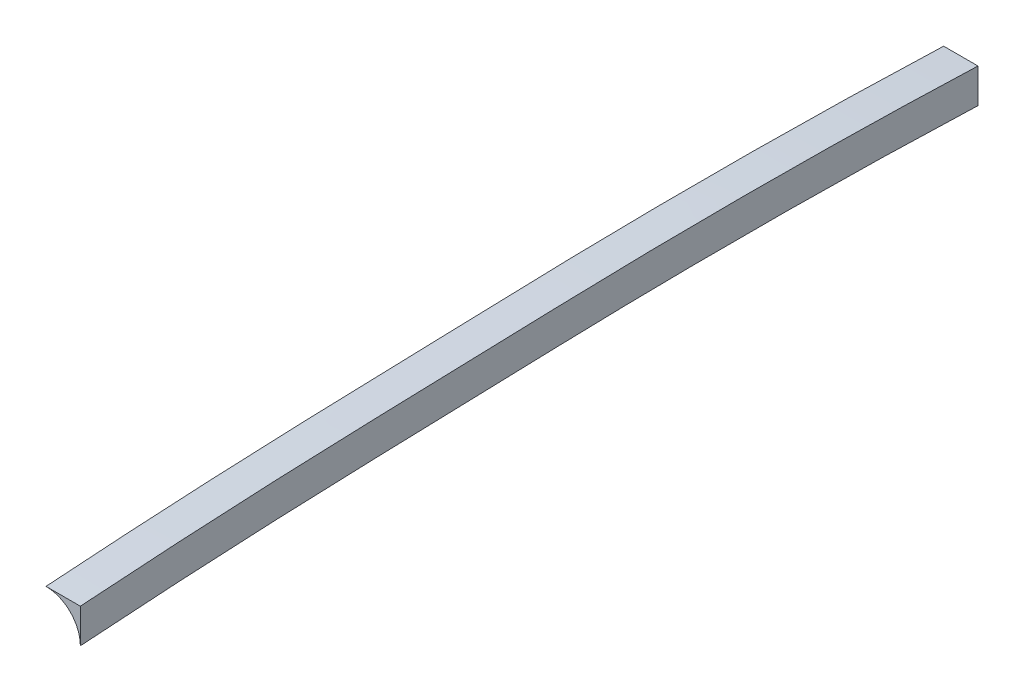
ISO-10303-21;
HEADER;
FILE_DESCRIPTION(('STEP AP214'),'2;1');
FILE_NAME('part.step','',(''),(''),'','','');
FILE_SCHEMA(('AUTOMOTIVE_DESIGN { 1 0 10303 214 1 1 1 1 }'));
ENDSEC;
DATA;
#1=APPLICATION_CONTEXT('core data for automotive mechanical design processes');
#2=APPLICATION_PROTOCOL_DEFINITION('international standard','automotive_design',2000,#1);
#3=PRODUCT_CONTEXT('',#1,'mechanical');
#4=PRODUCT('Part','Part','',(#3));
#5=PRODUCT_RELATED_PRODUCT_CATEGORY('part','',(#4));
#6=PRODUCT_DEFINITION_FORMATION('','',#4);
#7=PRODUCT_DEFINITION_CONTEXT('part definition',#1,'design');
#8=PRODUCT_DEFINITION('design','',#6,#7);
#9=PRODUCT_DEFINITION_SHAPE('','',#8);
#10=(LENGTH_UNIT() NAMED_UNIT(*) SI_UNIT(.MILLI.,.METRE.));
#11=(NAMED_UNIT(*) PLANE_ANGLE_UNIT() SI_UNIT($,.RADIAN.));
#12=(NAMED_UNIT(*) SI_UNIT($,.STERADIAN.) SOLID_ANGLE_UNIT());
#13=UNCERTAINTY_MEASURE_WITH_UNIT(LENGTH_MEASURE(1.E-05),#10,'distance_accuracy_value','');
#14=(GEOMETRIC_REPRESENTATION_CONTEXT(3) GLOBAL_UNCERTAINTY_ASSIGNED_CONTEXT((#13)) GLOBAL_UNIT_ASSIGNED_CONTEXT((#10,
#11,#12)) REPRESENTATION_CONTEXT('',''));
#15=CARTESIAN_POINT('',(0.,0.,0.));
#16=DIRECTION('',(0.,0.,1.));
#17=DIRECTION('',(1.,0.,0.));
#18=AXIS2_PLACEMENT_3D('',#15,#16,#17);
#19=CARTESIAN_POINT('',(-545.921789204398,117.985789350296,0.));
#20=DIRECTION('',(0.,0.,1.));
#21=DIRECTION('',(1.,0.,0.));
#22=AXIS2_PLACEMENT_3D('',#19,#20,#21);
#23=PLANE('',#22);
#24=DIRECTION('',(0.,-1.,0.));
#25=VECTOR('',#24,1.);
#26=CARTESIAN_POINT('',(-469.721789204398,194.185789350296,0.));
#27=LINE('',#26,#25);
#28=CARTESIAN_POINT('',(-469.721789204398,194.185789350296,0.));
#29=VERTEX_POINT('',#28);
#30=CARTESIAN_POINT('',(-469.721789204398,117.985789350296,0.));
#31=VERTEX_POINT('',#30);
#32=EDGE_CURVE('E294',#29,#31,#27,.T.);
#33=ORIENTED_EDGE('',*,*,#32,.F.);
#34=DIRECTION('',(1.,0.,0.));
#35=VECTOR('',#34,1.);
#36=CARTESIAN_POINT('',(-545.921789204398,194.185789350296,0.));
#37=LINE('',#36,#35);
#38=CARTESIAN_POINT('',(-545.921789204398,194.185789350296,0.));
#39=VERTEX_POINT('',#38);
#40=EDGE_CURVE('E13',#39,#29,#37,.T.);
#41=ORIENTED_EDGE('',*,*,#40,.F.);
#42=CARTESIAN_POINT('',(-545.921789204398,117.985789350296,0.));
#43=DIRECTION('',(0.,0.,1.));
#44=DIRECTION('',(1.,0.,0.));
#45=AXIS2_PLACEMENT_3D('',#42,#43,#44);
#46=CIRCLE('',#45,76.2);
#47=EDGE_CURVE('E71',#31,#39,#46,.T.);
#48=ORIENTED_EDGE('',*,*,#47,.F.);
#49=EDGE_LOOP('',(#33,#41,#48));
#50=FACE_BOUND('',#49,.T.);
#51=ADVANCED_FACE('F61',(#50),#23,.T.);
#52=CARTESIAN_POINT('',(-606.847797557808,99.1964787102209,-2052.91158045471));
#53=DIRECTION('',(0.,0.,-1.));
#54=DIRECTION('',(-1.,0.,0.));
#55=AXIS2_PLACEMENT_3D('',#52,#53,#54);
#56=PLANE('',#55);
#57=DIRECTION('',(1.,0.,0.));
#58=VECTOR('',#57,1.);
#59=CARTESIAN_POINT('',(-606.847797557808,175.396478710221,-2052.91158045471));
#60=LINE('',#59,#58);
#61=CARTESIAN_POINT('',(-606.847797557808,175.396478710221,-2052.91158045471));
#62=VERTEX_POINT('',#61);
#63=CARTESIAN_POINT('',(-530.647797557808,175.396478710221,-2052.91158045471));
#64=VERTEX_POINT('',#63);
#65=EDGE_CURVE('E117',#62,#64,#60,.T.);
#66=ORIENTED_EDGE('',*,*,#65,.T.);
#67=DIRECTION('',(0.,-1.,0.));
#68=VECTOR('',#67,1.);
#69=CARTESIAN_POINT('',(-530.647797557808,175.396478710221,-2052.91158045471));
#70=LINE('',#69,#68);
#71=CARTESIAN_POINT('',(-530.647797557808,99.1964787102209,-2052.91158045471));
#72=VERTEX_POINT('',#71);
#73=EDGE_CURVE('E119',#64,#72,#70,.T.);
#74=ORIENTED_EDGE('',*,*,#73,.T.);
#75=CARTESIAN_POINT('',(-606.847797557808,99.1964787102209,-2052.91158045471));
#76=DIRECTION('',(0.,0.,-1.));
#77=DIRECTION('',(-1.,0.,0.));
#78=AXIS2_PLACEMENT_3D('',#75,#76,#77);
#79=CIRCLE('',#78,76.2);
#80=EDGE_CURVE('E113',#62,#72,#79,.T.);
#81=ORIENTED_EDGE('',*,*,#80,.F.);
#82=EDGE_LOOP('',(#66,#74,#81));
#83=FACE_BOUND('',#82,.T.);
#84=ADVANCED_FACE('F116',(#83),#56,.T.);
#85=CARTESIAN_POINT('',(-606.847797557808,175.396478710221,-2052.91158045471));
#86=CARTESIAN_POINT('',(-597.376372189328,196.648578021864,-1733.77039021659));
#87=CARTESIAN_POINT('',(-587.881578666639,207.342137707288,-1413.84180629096));
#88=CARTESIAN_POINT('',(-578.310474641389,207.45685674874,-1091.34192779564));
#89=CARTESIAN_POINT('',(-574.204144997165,207.469413341588,-952.978494713137));
#90=CARTESIAN_POINT('',(-570.097833807677,207.457359861805,-814.615683465902));
#91=CARTESIAN_POINT('',(-565.379060869401,207.457360722524,-655.615875792079));
#92=CARTESIAN_POINT('',(-564.000054440902,207.391875942113,-609.150033976814));
#93=CARTESIAN_POINT('',(-561.949394640831,206.997951184578,-540.052724553207));
#94=CARTESIAN_POINT('',(-559.872545005746,206.307770025725,-470.072944456736));
#95=CARTESIAN_POINT('',(-557.794917737441,205.337339951727,-400.066961884713));
#96=CARTESIAN_POINT('',(-555.064086243532,203.680485786831,-308.051158623858));
#97=CARTESIAN_POINT('',(-552.275019320519,201.410222957753,-214.073103279994));
#98=CARTESIAN_POINT('',(-549.035762855082,198.102742833583,-104.925839415533));
#99=CARTESIAN_POINT('',(-547.125262310179,195.790355029051,-40.5512184762108));
#100=CARTESIAN_POINT('',(-545.921789204398,194.185789350296,0.));
#101=CARTESIAN_POINT('',(-601.860519252684,175.396478710221,-2052.91158045471));
#102=CARTESIAN_POINT('',(-592.386964447296,196.653356078273,-1733.69863849988));
#103=CARTESIAN_POINT('',(-582.890030968084,207.34693865992,-1413.69794839752));
#104=CARTESIAN_POINT('',(-573.316778636801,207.456877741312,-1091.12568238737));
#105=CARTESIAN_POINT('',(-569.209526171201,207.468911143585,-952.731154691248));
#106=CARTESIAN_POINT('',(-565.10229139139,207.457359815421,-814.337222920589));
#107=CARTESIAN_POINT('',(-560.38245754318,207.457360732473,-655.30166771713));
#108=CARTESIAN_POINT('',(-559.004058427442,207.390917705923,-608.856289402324));
#109=CARTESIAN_POINT('',(-556.955485908448,206.996388878634,-539.829311247942));
#110=CARTESIAN_POINT('',(-554.879013320508,206.305179186966,-469.862235815189));
#111=CARTESIAN_POINT('',(-552.801712611809,205.334337869534,-399.867256721233));
#112=CARTESIAN_POINT('',(-550.073887116512,203.678451998849,-307.952741063626));
#113=CARTESIAN_POINT('',(-547.284001595776,201.406905296455,-213.947102938782));
#114=CARTESIAN_POINT('',(-544.048311948216,198.102652848925,-104.920023572266));
#115=CARTESIAN_POINT('',(-542.137474554513,195.78981985861,-40.5340524588313));
#116=CARTESIAN_POINT('',(-540.934510899275,194.185789350296,0.));
#117=CARTESIAN_POINT('',(-591.886081759963,174.414364291729,-2052.91158045471));
#118=CARTESIAN_POINT('',(-582.408268080756,195.680797772597,-1733.55513506647));
#119=CARTESIAN_POINT('',(-572.907054688499,206.374426146693,-1413.41023261064));
#120=CARTESIAN_POINT('',(-563.329505745151,206.474805307965,-1090.69319157083));
#121=CARTESIAN_POINT('',(-559.220407636799,206.485792329088,-952.236474647468));
#122=CARTESIAN_POINT('',(-555.111325676342,206.475245304162,-813.780301829962));
#123=CARTESIAN_POINT('',(-550.389370008263,206.475246333879,-654.673251567231));
#124=CARTESIAN_POINT('',(-549.012185518048,206.406886815053,-608.268800253343));
#125=CARTESIAN_POINT('',(-546.967787561209,206.011149848255,-539.382484637409));
#126=CARTESIAN_POINT('',(-544.892069067557,205.317883090956,-469.440818532095));
#127=CARTESIAN_POINT('',(-542.815421478069,204.346219286656,-399.46784639427));
#128=CARTESIAN_POINT('',(-540.093607979996,202.692270004396,-307.755905943161));
#129=CARTESIAN_POINT('',(-537.302085263815,200.418155555368,-213.695102256356));
#130=CARTESIAN_POINT('',(-534.073529252011,197.120358461117,-104.90839188573));
#131=CARTESIAN_POINT('',(-532.162018160707,194.806635099236,-40.4997204240723));
#132=CARTESIAN_POINT('',(-530.960073406554,193.203674931805,0.));
#133=CARTESIAN_POINT('',(-577.499280780357,170.049993893497,-2052.91158045472));
#134=CARTESIAN_POINT('',(-568.015078790421,191.330761543591,-1733.33987991636));
#135=CARTESIAN_POINT('',(-558.507445528598,202.024458606358,-1412.97865893033));
#136=CARTESIAN_POINT('',(-548.923451667151,202.110497887449,-1090.04445534604));
#137=CARTESIAN_POINT('',(-544.811585094671,202.119915336847,-951.494454581807));
#138=CARTESIAN_POINT('',(-540.699732363244,202.110874766779,-812.944920194029));
#139=CARTESIAN_POINT('',(-535.974593965364,202.110875965494,-653.730627342387));
#140=CARTESIAN_POINT('',(-534.599231413432,202.039641708253,-607.387566529876));
#141=CARTESIAN_POINT('',(-532.561095299827,201.642092532192,-538.712244721615));
#142=CARTESIAN_POINT('',(-530.486507947605,200.945740176446,-468.808692607458));
#143=CARTESIAN_POINT('',(-528.410840036935,199.972842641844,-398.868730903831));
#144=CARTESIAN_POINT('',(-525.698044534699,198.32179824222,-307.460653262466));
#145=CARTESIAN_POINT('',(-522.90406602535,196.043832173243,-213.31710123272));
#146=CARTESIAN_POINT('',(-519.686210467178,192.755718108909,-104.890944355928));
#147=CARTESIAN_POINT('',(-517.773688829473,190.44065918968,-40.4482223719342));
#148=CARTESIAN_POINT('',(-516.573272426947,188.839304533572,0.));
#149=CARTESIAN_POINT('',(-564.240359995705,162.963047959866,-2052.91158045471));
#150=CARTESIAN_POINT('',(-554.749769695041,184.258149779185,-1733.12462476624));
#151=CARTESIAN_POINT('',(-545.235716563651,194.951915530623,-1412.54708525001));
#152=CARTESIAN_POINT('',(-535.645277784106,195.023614931534,-1089.39571912123));
#153=CARTESIAN_POINT('',(-531.530642747499,195.031462809208,-950.752434516135));
#154=CARTESIAN_POINT('',(-527.416019245102,195.023928693996,-812.109538558087));
#155=CARTESIAN_POINT('',(-522.68769811742,195.02393006171,-652.788003117537));
#156=CARTESIAN_POINT('',(-521.314157503771,194.949821066053,-606.506332806403));
#157=CARTESIAN_POINT('',(-519.282283233399,194.55045968073,-538.042004805815));
#158=CARTESIAN_POINT('',(-517.208827022609,193.851021726538,-468.176566682816));
#159=CARTESIAN_POINT('',(-515.134138790757,192.876890461633,-398.269615413386));
#160=CARTESIAN_POINT('',(-512.430361284357,191.228750944645,-307.165400581768));
#161=CARTESIAN_POINT('',(-509.63392698184,188.946933255719,-212.939100209082));
#162=CARTESIAN_POINT('',(-506.4267718773,185.668502221303,-104.873496826124));
#163=CARTESIAN_POINT('',(-504.513239693195,183.352107744726,-40.3967243197957));
#164=CARTESIAN_POINT('',(-503.314351642296,181.752358599941,0.));
#165=CARTESIAN_POINT('',(-552.618831684778,153.425444583251,-2052.91158045471));
#166=CARTESIAN_POINT('',(-543.121853073385,174.734880571795,-1732.90936961613));
#167=CARTESIAN_POINT('',(-533.601380072429,185.428715011904,-1412.1155115697));
#168=CARTESIAN_POINT('',(-524.004496374786,185.486074532635,-1088.74698289642));
#169=CARTESIAN_POINT('',(-519.88709287405,185.492352838585,-950.010414450469));
#170=CARTESIAN_POINT('',(-515.769698600685,185.48632517823,-811.27415692215));
#171=CARTESIAN_POINT('',(-511.038194743201,185.486326714943,-651.845378892689));
#172=CARTESIAN_POINT('',(-509.666476067834,185.40934298087,-605.625099082933));
#173=CARTESIAN_POINT('',(-507.640863640695,185.008169386284,-537.371764890018));
#174=CARTESIAN_POINT('',(-505.568538571337,184.305645833646,-467.544440758177));
#175=CARTESIAN_POINT('',(-503.494830018302,183.330280838438,-397.670499922945));
#176=CARTESIAN_POINT('',(-500.800070507738,181.685046204086,-306.870147901072));
#177=CARTESIAN_POINT('',(-498.001180412054,179.399376895211,-212.561099185445));
#178=CARTESIAN_POINT('',(-494.804725761145,176.130628890713,-104.856049296321));
#179=CARTESIAN_POINT('',(-492.89018303064,173.812898856788,-40.3452262676574));
#180=CARTESIAN_POINT('',(-491.692823331368,172.214755223326,0.));
#181=CARTESIAN_POINT('',(-543.081228308161,141.803916272323,-2052.91158045471));
#182=CARTESIAN_POINT('',(-533.577861386041,163.127686430093,-1732.69411446601));
#183=CARTESIAN_POINT('',(-524.050968515518,173.821589558873,-1411.68393788938));
#184=CARTESIAN_POINT('',(-514.447639899777,173.864609199424,-1088.09824667162));
#185=CARTESIAN_POINT('',(-510.327467934914,173.869317933649,-949.268394384803));
#186=CARTESIAN_POINT('',(-506.207302890579,173.864796728151,-810.438775286212));
#187=CARTESIAN_POINT('',(-501.472616303293,173.864798433863,-650.902754667843));
#188=CARTESIAN_POINT('',(-500.102719566209,173.784939961375,-604.743865359463));
#189=CARTESIAN_POINT('',(-498.083368982304,173.381954157525,-536.701524974221));
#190=CARTESIAN_POINT('',(-496.012175054377,172.676345006441,-466.912314833538));
#191=CARTESIAN_POINT('',(-493.93944618016,171.699746280931,-397.071384432503));
#192=CARTESIAN_POINT('',(-491.253704665433,170.057416529215,-306.574895220376));
#193=CARTESIAN_POINT('',(-488.45235877658,167.767895600391,-212.183098161808));
#194=CARTESIAN_POINT('',(-485.266604579304,164.508830625811,-104.838601766518));
#195=CARTESIAN_POINT('',(-483.351051302398,162.189765034538,-40.2937282155191));
#196=CARTESIAN_POINT('',(-482.155219954754,160.593226912399,0.));
#197=CARTESIAN_POINT('',(-535.994282374532,128.544995487672,-2052.91158045472));
#198=CARTESIAN_POINT('',(-526.484527141682,149.883099814667,-1732.4788593159));
#199=CARTESIAN_POINT('',(-516.951214401593,160.577071632118,-1411.25236420907));
#200=CARTESIAN_POINT('',(-507.341440867752,160.605751392488,-1087.44951044682));
#201=CARTESIAN_POINT('',(-503.218500438762,160.608890554989,-948.526374319138));
#202=CARTESIAN_POINT('',(-499.095564623457,160.605875804348,-809.603393650276));
#203=CARTESIAN_POINT('',(-494.357695306369,160.605877679058,-649.960130442997));
#204=CARTESIAN_POINT('',(-492.989620507568,160.523144468155,-603.862631635994));
#205=CARTESIAN_POINT('',(-490.976531766896,160.118346455043,-536.031285058425));
#206=CARTESIAN_POINT('',(-488.9064689804,159.409651705512,-466.280188908899));
#207=CARTESIAN_POINT('',(-486.834719785,158.431819249699,-396.472268942061));
#208=CARTESIAN_POINT('',(-484.157996266109,156.79239438062,-306.27964253968));
#209=CARTESIAN_POINT('',(-481.354194584089,154.499021831846,-211.805097138171));
#210=CARTESIAN_POINT('',(-478.179140840444,151.249639887184,-104.821154236716));
#211=CARTESIAN_POINT('',(-476.262577017138,148.929238738563,-40.2422301633808));
#212=CARTESIAN_POINT('',(-475.068274021122,147.334306127747,0.));
#213=CARTESIAN_POINT('',(-531.629911976299,114.158194508065,-2052.91158045471));
#214=CARTESIAN_POINT('',(-522.113768432721,135.510633004285,-1732.26360416579));
#215=CARTESIAN_POINT('',(-512.574035823065,146.204673510408,-1410.82079052876));
#216=CARTESIAN_POINT('',(-502.957817371127,146.219013390598,-1086.80077422201));
#217=CARTESIAN_POINT('',(-498.832108478008,146.220582981374,-947.784354253469));
#218=CARTESIAN_POINT('',(-494.706401891734,146.21907468559,-808.768012014337));
#219=CARTESIAN_POINT('',(-489.965349844844,146.219076729299,-649.017506218148));
#220=CARTESIAN_POINT('',(-488.599096984326,146.13346877998,-602.981397912522));
#221=CARTESIAN_POINT('',(-486.592270086888,145.726858557605,-535.361045142627));
#222=CARTESIAN_POINT('',(-484.523338441824,145.015078209628,-465.648062984258));
#223=CARTESIAN_POINT('',(-482.452568925241,144.036012023513,-395.873153451619));
#224=CARTESIAN_POINT('',(-479.784863402187,142.39949203707,-305.984389858983));
#225=CARTESIAN_POINT('',(-476.978605926999,140.102267868347,-211.427096114533));
#226=CARTESIAN_POINT('',(-473.814252636986,136.862568953602,-104.803706706913));
#227=CARTESIAN_POINT('',(-471.89667826728,134.540832247633,-40.1907321112424));
#228=CARTESIAN_POINT('',(-470.70390362289,132.947505148141,0.));
#229=CARTESIAN_POINT('',(-530.647797557808,104.183757015344,-2052.91158045471));
#230=CARTESIAN_POINT('',(-521.12739514041,125.545751624381,-1732.12010073238));
#231=CARTESIAN_POINT('',(-511.58338261771,136.239837922952,-1410.53307474188));
#232=CARTESIAN_POINT('',(-501.962867553706,136.244617883021,-1086.36828340548));
#233=CARTESIAN_POINT('',(-497.835313017836,136.245141092648,-947.289674209692));
#234=CARTESIAN_POINT('',(-493.707759250915,136.244637100102,-808.211090923712));
#235=CARTESIAN_POINT('',(-488.964585384158,136.244639256476,-648.38909006825));
#236=CARTESIAN_POINT('',(-487.599547149162,136.15711481488,-602.393908763542));
#237=CARTESIAN_POINT('',(-485.596894813879,135.749296452997,-534.914218532096));
#238=CARTESIAN_POINT('',(-483.528717263102,135.035459039389,-465.226645701165));
#239=CARTESIAN_POINT('',(-481.458600865732,134.055570366405,-395.473743124657));
#240=CARTESIAN_POINT('',(-478.796907339901,132.420986968387,-305.787554738519));
#241=CARTESIAN_POINT('',(-475.989012669268,130.121195053031,-211.175095432108));
#242=CARTESIAN_POINT('',(-472.83179301501,126.887951491564,-104.792075020377));
#243=CARTESIAN_POINT('',(-470.913544947703,124.56532441403,-40.1564000764836));
#244=CARTESIAN_POINT('',(-469.721789204398,122.97306765542,0.));
#245=CARTESIAN_POINT('',(-530.647797557808,99.1964787102209,-2052.91158045471));
#246=CARTESIAN_POINT('',(-521.125265703501,120.563251375666,-1732.04834901567));
#247=CARTESIAN_POINT('',(-511.579113224279,131.25736057046,-1410.38921684844));
#248=CARTESIAN_POINT('',(-501.956449854242,131.25736057047,-1086.15203799721));
#249=CARTESIAN_POINT('',(-497.827972496996,131.257360589521,-947.042334187803));
#250=CARTESIAN_POINT('',(-493.699495139752,131.257358748595,-807.932630378399));
#251=CARTESIAN_POINT('',(-488.95526036306,131.257360961302,-648.074881993301));
#252=CARTESIAN_POINT('',(-487.590829440825,131.168878273567,-602.100164189052));
#253=CARTESIAN_POINT('',(-485.59026438662,130.760455841929,-534.69080522683));
#254=CARTESIAN_POINT('',(-483.522463882987,130.045589895506,-465.015937059619));
#255=CARTESIAN_POINT('',(-481.452674045223,129.065289979088,-395.274037961177));
#256=CARTESIAN_POINT('',(-478.793986518004,127.431674875282,-305.689137178287));
#257=CARTESIAN_POINT('',(-475.985273249648,125.130599086609,-211.049095090896));
#258=CARTESIAN_POINT('',(-472.831620413268,121.900583201783,-104.78625917711));
#259=CARTESIAN_POINT('',(-470.913035497161,119.577510938465,-40.1392340591041));
#260=CARTESIAN_POINT('',(-469.721789204398,117.985789350296,0.));
#261=B_SPLINE_SURFACE_WITH_KNOTS('',3,3,((#85,#86,#87,#88,#89,#90,#91,#92,#93,#94,#95,#96,#97,
#98,#99,#100),(#101,#102,#103,#104,#105,#106,#107,#108,#109,#110,#111,#112,#113,#114,#115,#116),
(#117,#118,#119,#120,#121,#122,#123,#124,#125,#126,#127,#128,#129,#130,#131,#132),(#133,#134,
#135,#136,#137,#138,#139,#140,#141,#142,#143,#144,#145,#146,#147,#148),(#149,#150,#151,#152,
#153,#154,#155,#156,#157,#158,#159,#160,#161,#162,#163,#164),(#165,#166,#167,#168,#169,#170,
#171,#172,#173,#174,#175,#176,#177,#178,#179,#180),(#181,#182,#183,#184,#185,#186,#187,#188,
#189,#190,#191,#192,#193,#194,#195,#196),(#197,#198,#199,#200,#201,#202,#203,#204,#205,#206,
#207,#208,#209,#210,#211,#212),(#213,#214,#215,#216,#217,#218,#219,#220,#221,#222,#223,#224,
#225,#226,#227,#228),(#229,#230,#231,#232,#233,#234,#235,#236,#237,#238,#239,#240,#241,#242,
#243,#244),(#245,#246,#247,#248,#249,#250,#251,#252,#253,#254,#255,#256,#257,#258,#259,#260)),
.UNSPECIFIED.,.F.,.F.,.F.,(4,1,1,1,1,1,1,1,4),(4,2,1,2,1,1,1,1,1,1,1,4),(0.388984529648343,
0.4653614634423,0.541738397236257,0.618115331030214,0.694492264824171,0.770869198618129,
0.847246132412086,0.923623066206043,1.),(0.,0.465470706738681,0.469595434068376,
0.66694446115188,0.701118756002222,0.735293050852564,0.769467345702906,0.803641640553248,
0.83781593540359,0.906164525104274,0.940338819954616,1.),.UNSPECIFIED.);
#262=CARTESIAN_POINT('',(-530.647797557808,99.1964787102209,-2052.91158045471));
#263=CARTESIAN_POINT('',(-521.125265703501,120.563251375666,-1732.04834901567));
#264=CARTESIAN_POINT('',(-511.579113224279,131.25736057046,-1410.38921684844));
#265=CARTESIAN_POINT('',(-501.956449854242,131.25736057047,-1086.15203799721));
#266=CARTESIAN_POINT('',(-497.827972496996,131.257360589521,-947.042334187803));
#267=CARTESIAN_POINT('',(-493.699495139752,131.257358748595,-807.932630378399));
#268=CARTESIAN_POINT('',(-488.95526036306,131.257360961302,-648.074881993301));
#269=CARTESIAN_POINT('',(-487.590829440825,131.168878273567,-602.100164189052));
#270=CARTESIAN_POINT('',(-485.59026438662,130.760455841929,-534.69080522683));
#271=CARTESIAN_POINT('',(-483.522463882987,130.045589895506,-465.015937059619));
#272=CARTESIAN_POINT('',(-481.452674045223,129.065289979088,-395.274037961177));
#273=CARTESIAN_POINT('',(-478.793986518004,127.431674875282,-305.689137178287));
#274=CARTESIAN_POINT('',(-475.985273249648,125.130599086609,-211.049095090896));
#275=CARTESIAN_POINT('',(-472.831620413268,121.900583201783,-104.78625917711));
#276=CARTESIAN_POINT('',(-470.913035497161,119.577510938465,-40.1392340591041));
#277=CARTESIAN_POINT('',(-469.721789204398,117.985789350296,0.));
#278=B_SPLINE_CURVE_WITH_KNOTS('',3,(#262,#263,#264,#265,#266,#267,#268,#269,#270,#271,#272,
#273,#274,#275,#276,#277),.UNSPECIFIED.,.F.,.F.,(4,2,1,2,1,1,1,1,1,1,1,4),(0.,0.465470706738681,
0.469595434068376,0.66694446115188,0.701118756002222,0.735293050852564,0.769467345702906,
0.803641640553248,0.83781593540359,0.906164525104274,0.940338819954616,1.),.UNSPECIFIED.);
#279=CARTESIAN_POINT('',(-502.040971252252,131.25736057047,-1089.));
#280=VERTEX_POINT('',#279);
#281=EDGE_CURVE('E210',#72,#280,#278,.T.);
#282=CARTESIAN_POINT('',(-530.647797557808,99.1964787102209,-2052.91158045471));
#283=CARTESIAN_POINT('',(-521.125265703501,120.563251375666,-1732.04834901567));
#284=CARTESIAN_POINT('',(-511.579113224279,131.25736057046,-1410.38921684844));
#285=CARTESIAN_POINT('',(-501.956449854242,131.25736057047,-1086.15203799721));
#286=CARTESIAN_POINT('',(-497.827972496996,131.257360589521,-947.042334187803));
#287=CARTESIAN_POINT('',(-493.699495139752,131.257358748595,-807.932630378399));
#288=CARTESIAN_POINT('',(-488.95526036306,131.257360961302,-648.074881993301));
#289=CARTESIAN_POINT('',(-487.590829440825,131.168878273567,-602.100164189052));
#290=CARTESIAN_POINT('',(-485.59026438662,130.760455841929,-534.69080522683));
#291=CARTESIAN_POINT('',(-483.522463882987,130.045589895506,-465.015937059619));
#292=CARTESIAN_POINT('',(-481.452674045223,129.065289979088,-395.274037961177));
#293=CARTESIAN_POINT('',(-478.793986518004,127.431674875282,-305.689137178287));
#294=CARTESIAN_POINT('',(-475.985273249648,125.130599086609,-211.049095090896));
#295=CARTESIAN_POINT('',(-472.831620413268,121.900583201783,-104.78625917711));
#296=CARTESIAN_POINT('',(-470.913035497161,119.577510938465,-40.1392340591041));
#297=CARTESIAN_POINT('',(-469.721789204398,117.985789350296,0.));
#298=B_SPLINE_CURVE_WITH_KNOTS('',3,(#282,#283,#284,#285,#286,#287,#288,#289,#290,#291,#292,
#293,#294,#295,#296,#297),.UNSPECIFIED.,.F.,.F.,(4,2,1,2,1,1,1,1,1,1,1,4),(0.,0.465470706738681,
0.469595434068376,0.66694446115188,0.701118756002222,0.735293050852564,0.769467345702906,
0.803641640553248,0.83781593540359,0.906164525104274,0.940338819954616,1.),.UNSPECIFIED.);
#299=CARTESIAN_POINT('',(-489.655539180519,131.257360634692,-671.670888571788));
#300=VERTEX_POINT('',#299);
#301=EDGE_CURVE('E144',#280,#300,#298,.T.);
#302=CARTESIAN_POINT('',(-530.647797557808,99.1964787102209,-2052.91158045471));
#303=CARTESIAN_POINT('',(-521.125265703501,120.563251375666,-1732.04834901567));
#304=CARTESIAN_POINT('',(-511.579113224279,131.25736057046,-1410.38921684844));
#305=CARTESIAN_POINT('',(-501.956449854242,131.25736057047,-1086.15203799721));
#306=CARTESIAN_POINT('',(-497.827972496996,131.257360589521,-947.042334187803));
#307=CARTESIAN_POINT('',(-493.699495139752,131.257358748595,-807.932630378399));
#308=CARTESIAN_POINT('',(-488.95526036306,131.257360961302,-648.074881993301));
#309=CARTESIAN_POINT('',(-487.590829440825,131.168878273567,-602.100164189052));
#310=CARTESIAN_POINT('',(-485.59026438662,130.760455841929,-534.69080522683));
#311=CARTESIAN_POINT('',(-483.522463882987,130.045589895506,-465.015937059619));
#312=CARTESIAN_POINT('',(-481.452674045223,129.065289979088,-395.274037961177));
#313=CARTESIAN_POINT('',(-478.793986518004,127.431674875282,-305.689137178287));
#314=CARTESIAN_POINT('',(-475.985273249648,125.130599086609,-211.049095090896));
#315=CARTESIAN_POINT('',(-472.831620413268,121.900583201783,-104.78625917711));
#316=CARTESIAN_POINT('',(-470.913035497161,119.577510938465,-40.1392340591041));
#317=CARTESIAN_POINT('',(-469.721789204398,117.985789350296,0.));
#318=B_SPLINE_CURVE_WITH_KNOTS('',3,(#302,#303,#304,#305,#306,#307,#308,#309,#310,#311,#312,
#313,#314,#315,#316,#317),.UNSPECIFIED.,.F.,.F.,(4,2,1,2,1,1,1,1,1,1,1,4),(0.,0.465470706738681,
0.469595434068376,0.66694446115188,0.701118756002222,0.735293050852564,0.769467345702906,
0.803641640553248,0.83781593540359,0.906164525104274,0.940338819954616,1.),.UNSPECIFIED.);
#319=EDGE_CURVE('E142',#300,#31,#318,.T.);
#320=CARTESIAN_POINT('',(-606.847797557808,175.396478710221,-2052.91158045471));
#321=CARTESIAN_POINT('',(-597.376372189328,196.648578021864,-1733.77039021659));
#322=CARTESIAN_POINT('',(-587.881578666639,207.342137707288,-1413.84180629096));
#323=CARTESIAN_POINT('',(-578.310474641389,207.45685674874,-1091.34192779564));
#324=CARTESIAN_POINT('',(-574.204144997165,207.469413341588,-952.978494713137));
#325=CARTESIAN_POINT('',(-570.097833807677,207.457359861805,-814.615683465902));
#326=CARTESIAN_POINT('',(-565.379060869401,207.457360722524,-655.615875792079));
#327=CARTESIAN_POINT('',(-564.000054440902,207.391875942113,-609.150033976814));
#328=CARTESIAN_POINT('',(-561.949394640831,206.997951184578,-540.052724553207));
#329=CARTESIAN_POINT('',(-559.872545005746,206.307770025725,-470.072944456736));
#330=CARTESIAN_POINT('',(-557.794917737441,205.337339951727,-400.066961884713));
#331=CARTESIAN_POINT('',(-555.064086243532,203.680485786831,-308.051158623858));
#332=CARTESIAN_POINT('',(-552.275019320519,201.410222957753,-214.073103279994));
#333=CARTESIAN_POINT('',(-549.035762855082,198.102742833583,-104.925839415533));
#334=CARTESIAN_POINT('',(-547.125262310179,195.790355029051,-40.5512184762108));
#335=CARTESIAN_POINT('',(-545.921789204398,194.185789350296,0.));
#336=B_SPLINE_CURVE_WITH_KNOTS('',3,(#320,#321,#322,#323,#324,#325,#326,#327,#328,#329,#330,
#331,#332,#333,#334,#335),.UNSPECIFIED.,.F.,.F.,(4,2,1,2,1,1,1,1,1,1,1,4),(0.,0.465470706738681,
0.469595434068376,0.66694446115188,0.701118756002222,0.735293050852564,0.769467345702906,
0.803641640553248,0.83781593540359,0.906164525104274,0.940338819954616,1.),.UNSPECIFIED.);
#337=EDGE_CURVE('E132',#62,#39,#336,.T.);
#338=ORIENTED_EDGE('',*,*,#80,.T.);
#339=ORIENTED_EDGE('',*,*,#281,.T.);
#340=ORIENTED_EDGE('',*,*,#301,.T.);
#341=ORIENTED_EDGE('',*,*,#319,.T.);
#342=ORIENTED_EDGE('',*,*,#47,.T.);
#343=ORIENTED_EDGE('',*,*,#337,.F.);
#344=EDGE_LOOP('',(#338,#339,#340,#341,#342,#343));
#345=FACE_BOUND('',#344,.T.);
#346=ADVANCED_FACE('F139',(#345),#261,.T.);
#347=CARTESIAN_POINT('',(-530.647797557808,175.396478710221,-2052.91158045471));
#348=CARTESIAN_POINT('',(-521.208907588703,196.57557469747,-1734.86667569392));
#349=CARTESIAN_POINT('',(-511.74681019323,207.268784554364,-1416.03979299593));
#350=CARTESIAN_POINT('',(-502.208529866322,207.456536005865,-1094.64591425773));
#351=CARTESIAN_POINT('',(-498.11629989412,207.477086361865,-956.757571875512));
#352=CARTESIAN_POINT('',(-494.024100125303,207.457360570496,-818.870247201188));
#353=CARTESIAN_POINT('',(-489.321536696803,207.457360570513,-660.416621547683));
#354=CARTESIAN_POINT('',(-487.933251212825,207.406516712627,-613.638120476321));
#355=CARTESIAN_POINT('',(-485.850700107043,207.02182146108,-543.466228414219));
#356=CARTESIAN_POINT('',(-483.768089615954,206.347355126071,-473.292335354749));
#357=CARTESIAN_POINT('',(-481.685472884403,205.383208388908,-403.11823202189));
#358=CARTESIAN_POINT('',(-478.908713114841,203.71155977823,-309.554868178864));
#359=CARTESIAN_POINT('',(-476.132153443727,201.460913088475,-215.998246684976));
#360=CARTESIAN_POINT('',(-472.838400015447,198.104117697889,-105.014698955145));
#361=CARTESIAN_POINT('',(-470.9330461411,195.798531831076,-40.8134959020482));
#362=CARTESIAN_POINT('',(-469.721789204398,194.185789350296,0.));
#363=CARTESIAN_POINT('',(-536.997797557808,175.396478710221,-2052.91158045471));
#364=CARTESIAN_POINT('',(-527.556196305421,196.581658307836,-1734.77531857081));
#365=CARTESIAN_POINT('',(-518.09137423268,207.274897317108,-1415.85662743719));
#366=CARTESIAN_POINT('',(-508.550358597577,207.456562734438,-1094.37058205256));
#367=CARTESIAN_POINT('',(-504.456953652707,207.476446943508,-956.442648778648));
#368=CARTESIAN_POINT('',(-500.363577932168,207.457360511439,-818.515700223247));
#369=CARTESIAN_POINT('',(-495.659663711186,207.457360583181,-660.016559401383));
#370=CARTESIAN_POINT('',(-494.272151481832,207.405296648417,-613.264113268028));
#371=CARTESIAN_POINT('',(-492.192257984858,207.019832271371,-543.181769759135));
#372=CARTESIAN_POINT('',(-490.110127565103,206.344056367709,-473.024052779915));
#373=CARTESIAN_POINT('',(-488.027926622156,205.379386019143,-402.863959510459));
#374=CARTESIAN_POINT('',(-485.254994208899,203.708970278947,-309.42955904928));
#375=CARTESIAN_POINT('',(-482.477392266793,201.456688910915,-215.837818067894));
#376=CARTESIAN_POINT('',(-479.188180252083,198.104003125863,-105.007293993511));
#377=CARTESIAN_POINT('',(-477.282397488523,195.797850430907,-40.7916394498951));
#378=CARTESIAN_POINT('',(-476.071789204399,194.185789350296,0.));
#379=CARTESIAN_POINT('',(-549.697797557808,175.396478710221,-2052.91158045471));
#380=CARTESIAN_POINT('',(-540.250773738859,196.593825528569,-1734.59260432458));
#381=CARTESIAN_POINT('',(-530.780502311582,207.287122842595,-1415.49029631969));
#382=CARTESIAN_POINT('',(-521.234016060089,207.456616191584,-1093.81991764221));
#383=CARTESIAN_POINT('',(-517.138261169881,207.475168106796,-955.812802584918));
#384=CARTESIAN_POINT('',(-513.042533545897,207.457360393324,-817.806606267366));
#385=CARTESIAN_POINT('',(-508.335917739952,207.457360608516,-659.216435108782));
#386=CARTESIAN_POINT('',(-506.949952019845,207.402856519998,-612.516098851444));
#387=CARTESIAN_POINT('',(-504.87537374049,207.015853891954,-542.612852448966));
#388=CARTESIAN_POINT('',(-502.794203463402,206.337458850985,-472.487487630246));
#389=CARTESIAN_POINT('',(-500.712834097663,205.371741279613,-402.355414487596));
#390=CARTESIAN_POINT('',(-497.947556397014,203.70379128038,-309.178940790113));
#391=CARTESIAN_POINT('',(-495.167869912925,201.448240555795,-215.51696083373));
#392=CARTESIAN_POINT('',(-491.887740725356,198.103773981813,-104.992484070242));
#393=CARTESIAN_POINT('',(-489.98110018337,195.79648763057,-40.7479265455888));
#394=CARTESIAN_POINT('',(-488.771789204399,194.185789350296,0.));
#395=CARTESIAN_POINT('',(-568.747797557808,175.39647871022,-2052.91158045471));
#396=CARTESIAN_POINT('',(-559.292639889016,196.612076359667,-1734.31853295525));
#397=CARTESIAN_POINT('',(-549.814194429934,207.305461130826,-1414.94079964345));
#398=CARTESIAN_POINT('',(-540.259502253856,207.456696377303,-1092.99392102669));
#399=CARTESIAN_POINT('',(-536.160222445642,207.473249851726,-954.868033294325));
#400=CARTESIAN_POINT('',(-532.06096696649,207.45736021615,-816.742965333545));
#401=CARTESIAN_POINT('',(-527.350298783101,207.457360646518,-658.016248669882));
#402=CARTESIAN_POINT('',(-525.966652826864,207.39919632737,-611.394077226568));
#403=CARTESIAN_POINT('',(-523.900047373936,207.009886322829,-541.759476483713));
#404=CARTESIAN_POINT('',(-521.82031731085,206.327562575898,-471.682639905743));
#405=CARTESIAN_POINT('',(-519.740195310922,205.360274170318,-401.592596953302));
#406=CARTESIAN_POINT('',(-516.986399679187,203.69602278253,-308.803013401361));
#407=CARTESIAN_POINT('',(-514.203586382123,201.435568023114,-215.035674982485));
#408=CARTESIAN_POINT('',(-510.937081435265,198.103430265736,-104.970269185339));
#409=CARTESIAN_POINT('',(-509.029154225639,195.794443430063,-40.6823571891295));
#410=CARTESIAN_POINT('',(-507.821789204398,194.185789350296,0.));
#411=CARTESIAN_POINT('',(-587.797797557808,175.396478710221,-2052.91158045471));
#412=CARTESIAN_POINT('',(-578.334506039172,196.630327190766,-1734.04446158592));
#413=CARTESIAN_POINT('',(-568.847886548287,207.323799419057,-1414.3913029672));
#414=CARTESIAN_POINT('',(-559.284988447622,207.456776563022,-1092.16792441116));
#415=CARTESIAN_POINT('',(-555.182183721404,207.471331596657,-953.92326400373));
#416=CARTESIAN_POINT('',(-551.079400387084,207.457360038978,-815.679324399723));
#417=CARTESIAN_POINT('',(-546.364679826251,207.457360684521,-656.81606223098));
#418=CARTESIAN_POINT('',(-544.983353633883,207.395536134741,-610.272055601691));
#419=CARTESIAN_POINT('',(-542.924721007384,207.003918753703,-540.90610051846));
#420=CARTESIAN_POINT('',(-540.846431158298,206.317666300812,-470.877792181239));
#421=CARTESIAN_POINT('',(-538.767556524182,205.348807061023,-400.829779419007));
#422=CARTESIAN_POINT('',(-536.02524296136,203.688254284681,-308.427086012609));
#423=CARTESIAN_POINT('',(-533.239302851321,201.422895490434,-214.554389131239));
#424=CARTESIAN_POINT('',(-529.986422145174,198.10308654966,-104.948054300436));
#425=CARTESIAN_POINT('',(-528.077208267909,195.792399229557,-40.6167878326701));
#426=CARTESIAN_POINT('',(-526.871789204399,194.185789350296,0.));
#427=CARTESIAN_POINT('',(-600.497797557808,175.396478710221,-2052.91158045471));
#428=CARTESIAN_POINT('',(-591.02908347261,196.642494411498,-1733.8617473397));
#429=CARTESIAN_POINT('',(-581.537014627188,207.336024944544,-1414.02497184971));
#430=CARTESIAN_POINT('',(-571.968645910134,207.456830020167,-1091.61726000081));
#431=CARTESIAN_POINT('',(-567.863491238578,207.470052759944,-953.293417810001));
#432=CARTESIAN_POINT('',(-563.758356000813,207.457359920863,-814.970230443842));
#433=CARTESIAN_POINT('',(-559.040933855018,207.457360709856,-656.01593793838));
#434=CARTESIAN_POINT('',(-557.661154171896,207.393096006322,-609.524041185107));
#435=CARTESIAN_POINT('',(-555.607836763015,206.999940374286,-540.337183208292));
#436=CARTESIAN_POINT('',(-553.530507056597,206.311068784087,-470.34122703157));
#437=CARTESIAN_POINT('',(-551.452463999688,205.341162321493,-400.321234396145));
#438=CARTESIAN_POINT('',(-548.717805149475,203.683075286114,-308.176467753442));
#439=CARTESIAN_POINT('',(-545.929780497453,201.414447135313,-214.233531897076));
#440=CARTESIAN_POINT('',(-542.685982618446,198.102857405609,-104.933244377168));
#441=CARTESIAN_POINT('',(-540.775910962756,195.79103642922,-40.5730749283639));
#442=CARTESIAN_POINT('',(-539.571789204399,194.185789350296,0.));
#443=CARTESIAN_POINT('',(-606.847797557808,175.396478710221,-2052.91158045471));
#444=CARTESIAN_POINT('',(-597.376372189328,196.648578021864,-1733.77039021659));
#445=CARTESIAN_POINT('',(-587.881578666639,207.342137707288,-1413.84180629096));
#446=CARTESIAN_POINT('',(-578.310474641389,207.45685674874,-1091.34192779564));
#447=CARTESIAN_POINT('',(-574.204144997165,207.469413341588,-952.978494713137));
#448=CARTESIAN_POINT('',(-570.097833807677,207.457359861805,-814.615683465902));
#449=CARTESIAN_POINT('',(-565.379060869401,207.457360722524,-655.615875792079));
#450=CARTESIAN_POINT('',(-564.000054440902,207.391875942113,-609.150033976814));
#451=CARTESIAN_POINT('',(-561.949394640831,206.997951184578,-540.052724553207));
#452=CARTESIAN_POINT('',(-559.872545005746,206.307770025725,-470.072944456736));
#453=CARTESIAN_POINT('',(-557.794917737441,205.337339951727,-400.066961884713));
#454=CARTESIAN_POINT('',(-555.064086243532,203.680485786831,-308.051158623858));
#455=CARTESIAN_POINT('',(-552.275019320519,201.410222957753,-214.073103279994));
#456=CARTESIAN_POINT('',(-549.035762855082,198.102742833583,-104.925839415533));
#457=CARTESIAN_POINT('',(-547.125262310179,195.790355029051,-40.5512184762108));
#458=CARTESIAN_POINT('',(-545.921789204398,194.185789350296,0.));
#459=B_SPLINE_SURFACE_WITH_KNOTS('',3,3,((#347,#348,#349,#350,#351,#352,#353,#354,#355,#356,
#357,#358,#359,#360,#361,#362),(#363,#364,#365,#366,#367,#368,#369,#370,#371,#372,#373,#374,
#375,#376,#377,#378),(#379,#380,#381,#382,#383,#384,#385,#386,#387,#388,#389,#390,#391,#392,
#393,#394),(#395,#396,#397,#398,#399,#400,#401,#402,#403,#404,#405,#406,#407,#408,#409,#410),
(#411,#412,#413,#414,#415,#416,#417,#418,#419,#420,#421,#422,#423,#424,#425,#426),(#427,#428,
#429,#430,#431,#432,#433,#434,#435,#436,#437,#438,#439,#440,#441,#442),(#443,#444,#445,#446,
#447,#448,#449,#450,#451,#452,#453,#454,#455,#456,#457,#458)),.UNSPECIFIED.,.F.,.F.,.F.,(4,1,1,
1,4),(4,2,1,2,1,1,1,1,1,1,1,4),(0.,0.0972461324120857,0.194492264824171,0.291738397236257,
0.388984529648343),(0.,0.465470706738681,0.469595434068376,0.66694446115188,0.701118756002222,
0.735293050852564,0.769467345702906,0.803641640553248,0.83781593540359,0.906164525104274,
0.940338819954616,1.),.UNSPECIFIED.);
#460=CARTESIAN_POINT('',(-469.721789204398,194.185789350296,0.));
#461=CARTESIAN_POINT('',(-470.9330461411,195.798531831076,-40.8134959020482));
#462=CARTESIAN_POINT('',(-472.838400015447,198.104117697889,-105.014698955145));
#463=CARTESIAN_POINT('',(-476.132153443727,201.460913088475,-215.998246684976));
#464=CARTESIAN_POINT('',(-478.908713114841,203.71155977823,-309.554868178864));
#465=CARTESIAN_POINT('',(-481.685472884403,205.383208388908,-403.11823202189));
#466=CARTESIAN_POINT('',(-483.768089615954,206.347355126071,-473.292335354749));
#467=CARTESIAN_POINT('',(-485.850700107043,207.02182146108,-543.466228414219));
#468=CARTESIAN_POINT('',(-487.933251212825,207.406516712627,-613.638120476321));
#469=CARTESIAN_POINT('',(-489.321536696803,207.457360570513,-660.416621547683));
#470=CARTESIAN_POINT('',(-494.024100125303,207.457360570496,-818.870247201188));
#471=CARTESIAN_POINT('',(-498.11629989412,207.477086361865,-956.757571875512));
#472=CARTESIAN_POINT('',(-502.208529866322,207.456536005865,-1094.64591425773));
#473=CARTESIAN_POINT('',(-511.74681019323,207.268784554364,-1416.03979299593));
#474=CARTESIAN_POINT('',(-521.208907588703,196.57557469747,-1734.86667569392));
#475=CARTESIAN_POINT('',(-530.647797557808,175.396478710221,-2052.91158045471));
#476=B_SPLINE_CURVE_WITH_KNOTS('',3,(#460,#461,#462,#463,#464,#465,#466,#467,#468,#469,#470,
#471,#472,#473,#474,#475),.UNSPECIFIED.,.F.,.F.,(4,1,1,1,1,1,1,1,2,1,2,4),(0.,0.059661180045384,
0.0938354748957261,0.16218406459641,0.196358359446752,0.230532654297094,0.264706949147436,
0.298881243997778,0.33305553884812,0.530404565931624,0.534529293261319,1.),.UNSPECIFIED.);
#477=CARTESIAN_POINT('',(-489.655539180519,207.457360570512,-671.670888571786));
#478=VERTEX_POINT('',#477);
#479=EDGE_CURVE('E79',#478,#29,#476,.F.);
#480=CARTESIAN_POINT('',(-469.721789204398,194.185789350296,0.));
#481=CARTESIAN_POINT('',(-470.9330461411,195.798531831076,-40.8134959020482));
#482=CARTESIAN_POINT('',(-472.838400015447,198.104117697889,-105.014698955145));
#483=CARTESIAN_POINT('',(-476.132153443727,201.460913088475,-215.998246684976));
#484=CARTESIAN_POINT('',(-478.908713114841,203.71155977823,-309.554868178864));
#485=CARTESIAN_POINT('',(-481.685472884403,205.383208388908,-403.11823202189));
#486=CARTESIAN_POINT('',(-483.768089615954,206.347355126071,-473.292335354749));
#487=CARTESIAN_POINT('',(-485.850700107043,207.02182146108,-543.466228414219));
#488=CARTESIAN_POINT('',(-487.933251212825,207.406516712627,-613.638120476321));
#489=CARTESIAN_POINT('',(-489.321536696803,207.457360570513,-660.416621547683));
#490=CARTESIAN_POINT('',(-494.024100125303,207.457360570496,-818.870247201188));
#491=CARTESIAN_POINT('',(-498.11629989412,207.477086361865,-956.757571875512));
#492=CARTESIAN_POINT('',(-502.208529866322,207.456536005865,-1094.64591425773));
#493=CARTESIAN_POINT('',(-511.74681019323,207.268784554364,-1416.03979299593));
#494=CARTESIAN_POINT('',(-521.208907588703,196.57557469747,-1734.86667569392));
#495=CARTESIAN_POINT('',(-530.647797557808,175.396478710221,-2052.91158045471));
#496=B_SPLINE_CURVE_WITH_KNOTS('',3,(#480,#481,#482,#483,#484,#485,#486,#487,#488,#489,#490,
#491,#492,#493,#494,#495),.UNSPECIFIED.,.F.,.F.,(4,1,1,1,1,1,1,1,2,1,2,4),(0.,0.059661180045384,
0.0938354748957261,0.16218406459641,0.196358359446752,0.230532654297094,0.264706949147436,
0.298881243997778,0.33305553884812,0.530404565931624,0.534529293261319,1.),.UNSPECIFIED.);
#497=CARTESIAN_POINT('',(-502.040971252252,207.457360570466,-1089.));
#498=VERTEX_POINT('',#497);
#499=EDGE_CURVE('E145',#498,#478,#496,.F.);
#500=CARTESIAN_POINT('',(-469.721789204398,194.185789350296,0.));
#501=CARTESIAN_POINT('',(-470.9330461411,195.798531831076,-40.8134959020482));
#502=CARTESIAN_POINT('',(-472.838400015447,198.104117697889,-105.014698955145));
#503=CARTESIAN_POINT('',(-476.132153443727,201.460913088475,-215.998246684976));
#504=CARTESIAN_POINT('',(-478.908713114841,203.71155977823,-309.554868178864));
#505=CARTESIAN_POINT('',(-481.685472884403,205.383208388908,-403.11823202189));
#506=CARTESIAN_POINT('',(-483.768089615954,206.347355126071,-473.292335354749));
#507=CARTESIAN_POINT('',(-485.850700107043,207.02182146108,-543.466228414219));
#508=CARTESIAN_POINT('',(-487.933251212825,207.406516712627,-613.638120476321));
#509=CARTESIAN_POINT('',(-489.321536696803,207.457360570513,-660.416621547683));
#510=CARTESIAN_POINT('',(-494.024100125303,207.457360570496,-818.870247201188));
#511=CARTESIAN_POINT('',(-498.11629989412,207.477086361865,-956.757571875512));
#512=CARTESIAN_POINT('',(-502.208529866322,207.456536005865,-1094.64591425773));
#513=CARTESIAN_POINT('',(-511.74681019323,207.268784554364,-1416.03979299593));
#514=CARTESIAN_POINT('',(-521.208907588703,196.57557469747,-1734.86667569392));
#515=CARTESIAN_POINT('',(-530.647797557808,175.396478710221,-2052.91158045471));
#516=B_SPLINE_CURVE_WITH_KNOTS('',3,(#500,#501,#502,#503,#504,#505,#506,#507,#508,#509,#510,
#511,#512,#513,#514,#515),.UNSPECIFIED.,.F.,.F.,(4,1,1,1,1,1,1,1,2,1,2,4),(0.,0.059661180045384,
0.0938354748957261,0.16218406459641,0.196358359446752,0.230532654297094,0.264706949147436,
0.298881243997778,0.33305553884812,0.530404565931624,0.534529293261319,1.),.UNSPECIFIED.);
#517=EDGE_CURVE('E134',#64,#498,#516,.F.);
#518=ORIENTED_EDGE('',*,*,#65,.F.);
#519=ORIENTED_EDGE('',*,*,#337,.T.);
#520=ORIENTED_EDGE('',*,*,#40,.T.);
#521=ORIENTED_EDGE('',*,*,#479,.F.);
#522=ORIENTED_EDGE('',*,*,#499,.F.);
#523=ORIENTED_EDGE('',*,*,#517,.F.);
#524=EDGE_LOOP('',(#518,#519,#520,#521,#522,#523));
#525=FACE_BOUND('',#524,.T.);
#526=ADVANCED_FACE('F131',(#525),#459,.T.);
#527=CARTESIAN_POINT('',(-523.783478973855,188.945401766881,-1821.61726963779));
#528=DIRECTION('',(-0.999559903215433,0.,0.0296647919924279));
#529=DIRECTION('',(0.0296647919924279,0.,0.999559903215433));
#530=AXIS2_PLACEMENT_3D('',#527,#528,#529);
#531=PLANE('',#530);
#532=ORIENTED_EDGE('',*,*,#517,.T.);
#533=ORIENTED_EDGE('',*,*,#499,.T.);
#534=ORIENTED_EDGE('',*,*,#479,.T.);
#535=ORIENTED_EDGE('',*,*,#32,.T.);
#536=ORIENTED_EDGE('',*,*,#319,.F.);
#537=ORIENTED_EDGE('',*,*,#301,.F.);
#538=ORIENTED_EDGE('',*,*,#281,.F.);
#539=ORIENTED_EDGE('',*,*,#73,.F.);
#540=EDGE_LOOP('',(#532,#533,#534,#535,#536,#537,#538,#539));
#541=FACE_BOUND('',#540,.T.);
#542=ADVANCED_FACE('F160',(#541),#531,.F.);
#543=CLOSED_SHELL('',(#51,#84,#346,#526,#542));
#544=MANIFOLD_SOLID_BREP('B2',#543);
#545=ADVANCED_BREP_SHAPE_REPRESENTATION('',(#18,#544),#14);
#546=SHAPE_DEFINITION_REPRESENTATION(#9,#545);
ENDSEC;
END-ISO-10303-21;
